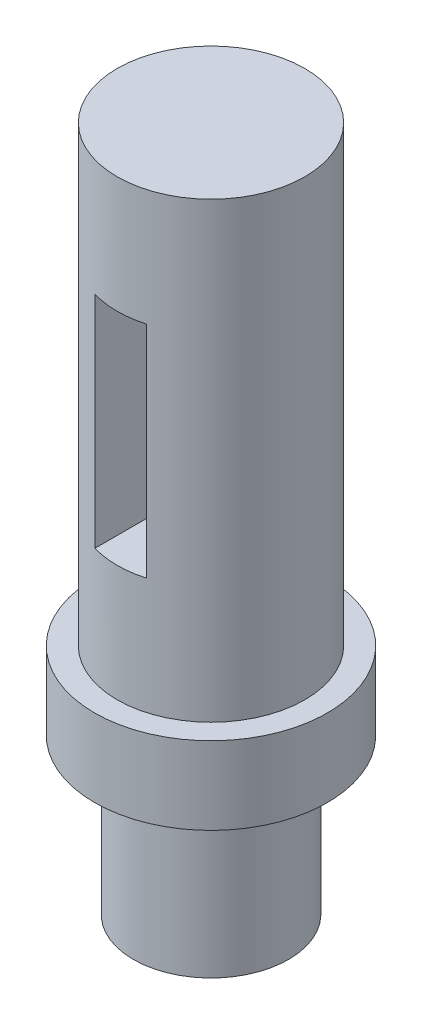
ISO-10303-21;
HEADER;
FILE_DESCRIPTION(('STEP AP214'),'2;1');
FILE_NAME('part.step','',(''),(''),'','','');
FILE_SCHEMA(('AUTOMOTIVE_DESIGN { 1 0 10303 214 1 1 1 1 }'));
ENDSEC;
DATA;
#1=APPLICATION_CONTEXT('core data for automotive mechanical design processes');
#2=APPLICATION_PROTOCOL_DEFINITION('international standard','automotive_design',2000,#1);
#3=PRODUCT_CONTEXT('',#1,'mechanical');
#4=PRODUCT('Part','Part','',(#3));
#5=PRODUCT_RELATED_PRODUCT_CATEGORY('part','',(#4));
#6=PRODUCT_DEFINITION_FORMATION('','',#4);
#7=PRODUCT_DEFINITION_CONTEXT('part definition',#1,'design');
#8=PRODUCT_DEFINITION('design','',#6,#7);
#9=PRODUCT_DEFINITION_SHAPE('','',#8);
#10=(LENGTH_UNIT() NAMED_UNIT(*) SI_UNIT(.MILLI.,.METRE.));
#11=(NAMED_UNIT(*) PLANE_ANGLE_UNIT() SI_UNIT($,.RADIAN.));
#12=(NAMED_UNIT(*) SI_UNIT($,.STERADIAN.) SOLID_ANGLE_UNIT());
#13=UNCERTAINTY_MEASURE_WITH_UNIT(LENGTH_MEASURE(1.E-05),#10,'distance_accuracy_value','');
#14=(GEOMETRIC_REPRESENTATION_CONTEXT(3) GLOBAL_UNCERTAINTY_ASSIGNED_CONTEXT((#13)) GLOBAL_UNIT_ASSIGNED_CONTEXT((#10,
#11,#12)) REPRESENTATION_CONTEXT('',''));
#15=CARTESIAN_POINT('',(0.,0.,0.));
#16=DIRECTION('',(0.,0.,1.));
#17=DIRECTION('',(1.,0.,0.));
#18=AXIS2_PLACEMENT_3D('',#15,#16,#17);
#19=CARTESIAN_POINT('',(0.,-24.,0.));
#20=DIRECTION('',(0.,1.,0.));
#21=DIRECTION('',(0.,0.,1.));
#22=AXIS2_PLACEMENT_3D('',#19,#20,#21);
#23=CYLINDRICAL_SURFACE('',#22,12.);
#24=CARTESIAN_POINT('',(0.,-24.,0.));
#25=DIRECTION('',(0.,1.,0.));
#26=DIRECTION('',(0.,0.,1.));
#27=AXIS2_PLACEMENT_3D('',#24,#25,#26);
#28=CIRCLE('',#27,12.);
#29=CARTESIAN_POINT('',(0.,-24.,12.));
#30=VERTEX_POINT('',#29);
#31=EDGE_CURVE('E119',#30,#30,#28,.T.);
#32=ORIENTED_EDGE('',*,*,#31,.T.);
#33=EDGE_LOOP('',(#32));
#34=FACE_BOUND('',#33,.T.);
#35=CARTESIAN_POINT('',(0.,0.,0.));
#36=DIRECTION('',(0.,1.,0.));
#37=DIRECTION('',(0.,0.,1.));
#38=AXIS2_PLACEMENT_3D('',#35,#36,#37);
#39=CIRCLE('',#38,12.);
#40=CARTESIAN_POINT('',(0.,0.,12.));
#41=VERTEX_POINT('',#40);
#42=EDGE_CURVE('E123',#41,#41,#39,.T.);
#43=ORIENTED_EDGE('',*,*,#42,.F.);
#44=EDGE_LOOP('',(#43));
#45=FACE_BOUND('',#44,.T.);
#46=ADVANCED_FACE('F39',(#34,#45),#23,.T.);
#47=CARTESIAN_POINT('',(0.,-24.,0.));
#48=DIRECTION('',(0.,1.,0.));
#49=DIRECTION('',(0.,0.,1.));
#50=AXIS2_PLACEMENT_3D('',#47,#48,#49);
#51=PLANE('',#50);
#52=ORIENTED_EDGE('',*,*,#31,.F.);
#53=EDGE_LOOP('',(#52));
#54=FACE_BOUND('',#53,.T.);
#55=ADVANCED_FACE('F135',(#54),#51,.F.);
#56=CARTESIAN_POINT('',(0.,12.,0.));
#57=DIRECTION('',(0.,-1.,0.));
#58=DIRECTION('',(0.,0.,-1.));
#59=AXIS2_PLACEMENT_3D('',#56,#57,#58);
#60=CYLINDRICAL_SURFACE('',#59,18.);
#61=CARTESIAN_POINT('',(0.,12.,0.));
#62=DIRECTION('',(0.,1.,0.));
#63=DIRECTION('',(0.,0.,1.));
#64=AXIS2_PLACEMENT_3D('',#61,#62,#63);
#65=CIRCLE('',#64,18.);
#66=CARTESIAN_POINT('',(0.,12.,18.));
#67=VERTEX_POINT('',#66);
#68=EDGE_CURVE('E120',#67,#67,#65,.T.);
#69=ORIENTED_EDGE('',*,*,#68,.F.);
#70=EDGE_LOOP('',(#69));
#71=FACE_BOUND('',#70,.T.);
#72=CARTESIAN_POINT('',(0.,0.,0.));
#73=DIRECTION('',(0.,1.,0.));
#74=DIRECTION('',(0.,0.,1.));
#75=AXIS2_PLACEMENT_3D('',#72,#73,#74);
#76=CIRCLE('',#75,18.);
#77=CARTESIAN_POINT('',(0.,0.,18.));
#78=VERTEX_POINT('',#77);
#79=EDGE_CURVE('E112',#78,#78,#76,.T.);
#80=ORIENTED_EDGE('',*,*,#79,.T.);
#81=EDGE_LOOP('',(#80));
#82=FACE_BOUND('',#81,.T.);
#83=ADVANCED_FACE('F140',(#71,#82),#60,.T.);
#84=CARTESIAN_POINT('',(0.,12.,0.));
#85=DIRECTION('',(0.,1.,0.));
#86=DIRECTION('',(0.,0.,1.));
#87=AXIS2_PLACEMENT_3D('',#84,#85,#86);
#88=PLANE('',#87);
#89=CARTESIAN_POINT('',(0.,12.,0.));
#90=DIRECTION('',(0.,1.,0.));
#91=DIRECTION('',(0.,0.,1.));
#92=AXIS2_PLACEMENT_3D('',#89,#90,#91);
#93=CIRCLE('',#92,14.5);
#94=CARTESIAN_POINT('',(0.,12.,14.5));
#95=VERTEX_POINT('',#94);
#96=EDGE_CURVE('E84',#95,#95,#93,.T.);
#97=ORIENTED_EDGE('',*,*,#96,.F.);
#98=EDGE_LOOP('',(#97));
#99=FACE_BOUND('',#98,.T.);
#100=ORIENTED_EDGE('',*,*,#68,.T.);
#101=EDGE_LOOP('',(#100));
#102=FACE_BOUND('',#101,.T.);
#103=ADVANCED_FACE('F146',(#99,#102),#88,.T.);
#104=CARTESIAN_POINT('',(0.,0.,0.));
#105=DIRECTION('',(0.,1.,0.));
#106=DIRECTION('',(0.,0.,1.));
#107=AXIS2_PLACEMENT_3D('',#104,#105,#106);
#108=PLANE('',#107);
#109=ORIENTED_EDGE('',*,*,#42,.T.);
#110=EDGE_LOOP('',(#109));
#111=FACE_BOUND('',#110,.T.);
#112=ORIENTED_EDGE('',*,*,#79,.F.);
#113=EDGE_LOOP('',(#112));
#114=FACE_BOUND('',#113,.T.);
#115=ADVANCED_FACE('F131',(#111,#114),#108,.F.);
#116=CARTESIAN_POINT('',(0.,82.,0.));
#117=DIRECTION('',(0.,-1.,0.));
#118=DIRECTION('',(0.,0.,-1.));
#119=AXIS2_PLACEMENT_3D('',#116,#117,#118);
#120=CYLINDRICAL_SURFACE('',#119,14.5);
#121=DIRECTION('',(0.,-1.,0.));
#122=VECTOR('',#121,1.);
#123=CARTESIAN_POINT('',(-4.,82.,-13.9373598647664));
#124=LINE('',#123,#122);
#125=CARTESIAN_POINT('',(-4.,64.,-13.9373598647664));
#126=VERTEX_POINT('',#125);
#127=CARTESIAN_POINT('',(-4.,30.,-13.9373598647664));
#128=VERTEX_POINT('',#127);
#129=EDGE_CURVE('E42',#126,#128,#124,.T.);
#130=ORIENTED_EDGE('',*,*,#129,.T.);
#131=CARTESIAN_POINT('',(0.,30.,0.));
#132=DIRECTION('',(0.,-1.,0.));
#133=DIRECTION('',(0.,0.,-1.));
#134=AXIS2_PLACEMENT_3D('',#131,#132,#133);
#135=CIRCLE('',#134,14.5);
#136=CARTESIAN_POINT('',(4.,30.,-13.9373598647664));
#137=VERTEX_POINT('',#136);
#138=EDGE_CURVE('E11',#128,#137,#135,.T.);
#139=ORIENTED_EDGE('',*,*,#138,.T.);
#140=DIRECTION('',(0.,-1.,0.));
#141=VECTOR('',#140,1.);
#142=CARTESIAN_POINT('',(4.,82.,-13.9373598647664));
#143=LINE('',#142,#141);
#144=CARTESIAN_POINT('',(4.,64.,-13.9373598647664));
#145=VERTEX_POINT('',#144);
#146=EDGE_CURVE('E101',#145,#137,#143,.T.);
#147=ORIENTED_EDGE('',*,*,#146,.F.);
#148=CARTESIAN_POINT('',(0.,64.,0.));
#149=DIRECTION('',(0.,-1.,0.));
#150=DIRECTION('',(0.,0.,-1.));
#151=AXIS2_PLACEMENT_3D('',#148,#149,#150);
#152=CIRCLE('',#151,14.5);
#153=EDGE_CURVE('E91',#126,#145,#152,.T.);
#154=ORIENTED_EDGE('',*,*,#153,.F.);
#155=EDGE_LOOP('',(#130,#139,#147,#154));
#156=FACE_BOUND('',#155,.T.);
#157=DIRECTION('',(0.,-1.,0.));
#158=VECTOR('',#157,1.);
#159=CARTESIAN_POINT('',(4.,82.,13.9373598647664));
#160=LINE('',#159,#158);
#161=CARTESIAN_POINT('',(4.,30.,13.9373598647664));
#162=VERTEX_POINT('',#161);
#163=CARTESIAN_POINT('',(4.,64.,13.9373598647664));
#164=VERTEX_POINT('',#163);
#165=EDGE_CURVE('E78',#162,#164,#160,.F.);
#166=ORIENTED_EDGE('',*,*,#165,.F.);
#167=CARTESIAN_POINT('',(-4.,30.,13.9373598647664));
#168=VERTEX_POINT('',#167);
#169=EDGE_CURVE('E48',#162,#168,#135,.T.);
#170=ORIENTED_EDGE('',*,*,#169,.T.);
#171=DIRECTION('',(0.,-1.,0.));
#172=VECTOR('',#171,1.);
#173=CARTESIAN_POINT('',(-4.,82.,13.9373598647664));
#174=LINE('',#173,#172);
#175=CARTESIAN_POINT('',(-4.,64.,13.9373598647664));
#176=VERTEX_POINT('',#175);
#177=EDGE_CURVE('E98',#168,#176,#174,.F.);
#178=ORIENTED_EDGE('',*,*,#177,.T.);
#179=EDGE_CURVE('E83',#164,#176,#152,.T.);
#180=ORIENTED_EDGE('',*,*,#179,.F.);
#181=EDGE_LOOP('',(#166,#170,#178,#180));
#182=FACE_BOUND('',#181,.T.);
#183=CARTESIAN_POINT('',(0.,82.,0.));
#184=DIRECTION('',(0.,1.,0.));
#185=DIRECTION('',(0.,0.,1.));
#186=AXIS2_PLACEMENT_3D('',#183,#184,#185);
#187=CIRCLE('',#186,14.5);
#188=CARTESIAN_POINT('',(0.,82.,14.5));
#189=VERTEX_POINT('',#188);
#190=EDGE_CURVE('E109',#189,#189,#187,.T.);
#191=ORIENTED_EDGE('',*,*,#190,.F.);
#192=EDGE_LOOP('',(#191));
#193=FACE_BOUND('',#192,.T.);
#194=ORIENTED_EDGE('',*,*,#96,.T.);
#195=EDGE_LOOP('',(#194));
#196=FACE_BOUND('',#195,.T.);
#197=ADVANCED_FACE('F96',(#156,#182,#193,#196),#120,.T.);
#198=CARTESIAN_POINT('',(0.,82.,0.));
#199=DIRECTION('',(0.,1.,0.));
#200=DIRECTION('',(0.,0.,1.));
#201=AXIS2_PLACEMENT_3D('',#198,#199,#200);
#202=PLANE('',#201);
#203=ORIENTED_EDGE('',*,*,#190,.T.);
#204=EDGE_LOOP('',(#203));
#205=FACE_BOUND('',#204,.T.);
#206=ADVANCED_FACE('F157',(#205),#202,.T.);
#207=CARTESIAN_POINT('',(-4.,30.,-18.));
#208=DIRECTION('',(0.,-1.,0.));
#209=DIRECTION('',(0.,0.,-1.));
#210=AXIS2_PLACEMENT_3D('',#207,#208,#209);
#211=PLANE('',#210);
#212=DIRECTION('',(0.,0.,1.));
#213=VECTOR('',#212,1.);
#214=CARTESIAN_POINT('',(4.,30.,-18.));
#215=LINE('',#214,#213);
#216=EDGE_CURVE('E60',#137,#162,#215,.T.);
#217=ORIENTED_EDGE('',*,*,#216,.F.);
#218=ORIENTED_EDGE('',*,*,#138,.F.);
#219=DIRECTION('',(0.,0.,1.));
#220=VECTOR('',#219,1.);
#221=CARTESIAN_POINT('',(-4.,30.,-18.));
#222=LINE('',#221,#220);
#223=EDGE_CURVE('E107',#128,#168,#222,.T.);
#224=ORIENTED_EDGE('',*,*,#223,.T.);
#225=ORIENTED_EDGE('',*,*,#169,.F.);
#226=EDGE_LOOP('',(#217,#218,#224,#225));
#227=FACE_BOUND('',#226,.T.);
#228=ADVANCED_FACE('F105',(#227),#211,.F.);
#229=CARTESIAN_POINT('',(-4.,64.,-18.));
#230=DIRECTION('',(-1.,0.,0.));
#231=DIRECTION('',(0.,-1.,0.));
#232=AXIS2_PLACEMENT_3D('',#229,#230,#231);
#233=PLANE('',#232);
#234=DIRECTION('',(0.,0.,1.));
#235=VECTOR('',#234,1.);
#236=CARTESIAN_POINT('',(-4.,64.,-18.));
#237=LINE('',#236,#235);
#238=EDGE_CURVE('E93',#126,#176,#237,.T.);
#239=ORIENTED_EDGE('',*,*,#238,.T.);
#240=ORIENTED_EDGE('',*,*,#177,.F.);
#241=ORIENTED_EDGE('',*,*,#223,.F.);
#242=ORIENTED_EDGE('',*,*,#129,.F.);
#243=EDGE_LOOP('',(#239,#240,#241,#242));
#244=FACE_BOUND('',#243,.T.);
#245=ADVANCED_FACE('F164',(#244),#233,.F.);
#246=CARTESIAN_POINT('',(-4.,64.,-18.));
#247=DIRECTION('',(0.,-1.,0.));
#248=DIRECTION('',(0.,0.,-1.));
#249=AXIS2_PLACEMENT_3D('',#246,#247,#248);
#250=PLANE('',#249);
#251=ORIENTED_EDGE('',*,*,#179,.T.);
#252=ORIENTED_EDGE('',*,*,#238,.F.);
#253=ORIENTED_EDGE('',*,*,#153,.T.);
#254=DIRECTION('',(0.,0.,1.));
#255=VECTOR('',#254,1.);
#256=CARTESIAN_POINT('',(4.,64.,-18.));
#257=LINE('',#256,#255);
#258=EDGE_CURVE('E55',#145,#164,#257,.T.);
#259=ORIENTED_EDGE('',*,*,#258,.T.);
#260=EDGE_LOOP('',(#251,#252,#253,#259));
#261=FACE_BOUND('',#260,.T.);
#262=ADVANCED_FACE('F87',(#261),#250,.T.);
#263=CARTESIAN_POINT('',(4.,64.,-18.));
#264=DIRECTION('',(-1.,0.,0.));
#265=DIRECTION('',(0.,-1.,0.));
#266=AXIS2_PLACEMENT_3D('',#263,#264,#265);
#267=PLANE('',#266);
#268=ORIENTED_EDGE('',*,*,#146,.T.);
#269=ORIENTED_EDGE('',*,*,#216,.T.);
#270=ORIENTED_EDGE('',*,*,#165,.T.);
#271=ORIENTED_EDGE('',*,*,#258,.F.);
#272=EDGE_LOOP('',(#268,#269,#270,#271));
#273=FACE_BOUND('',#272,.T.);
#274=ADVANCED_FACE('F79',(#273),#267,.T.);
#275=CLOSED_SHELL('',(#46,#55,#83,#103,#115,#197,#206,#228,#245,#262,#274));
#276=MANIFOLD_SOLID_BREP('B2',#275);
#277=ADVANCED_BREP_SHAPE_REPRESENTATION('',(#18,#276),#14);
#278=SHAPE_DEFINITION_REPRESENTATION(#9,#277);
ENDSEC;
END-ISO-10303-21;
